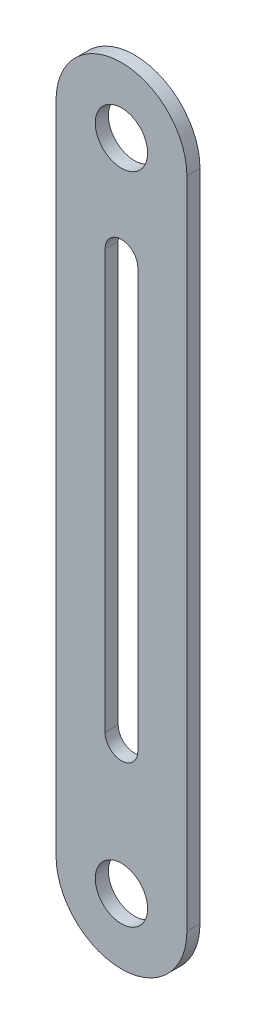
ISO-10303-21;
HEADER;
FILE_DESCRIPTION(('STEP AP214'),'2;1');
FILE_NAME('part.step','',(''),(''),'','','');
FILE_SCHEMA(('AUTOMOTIVE_DESIGN { 1 0 10303 214 1 1 1 1 }'));
ENDSEC;
DATA;
#1=APPLICATION_CONTEXT('core data for automotive mechanical design processes');
#2=APPLICATION_PROTOCOL_DEFINITION('international standard','automotive_design',2000,#1);
#3=PRODUCT_CONTEXT('',#1,'mechanical');
#4=PRODUCT('Part','Part','',(#3));
#5=PRODUCT_RELATED_PRODUCT_CATEGORY('part','',(#4));
#6=PRODUCT_DEFINITION_FORMATION('','',#4);
#7=PRODUCT_DEFINITION_CONTEXT('part definition',#1,'design');
#8=PRODUCT_DEFINITION('design','',#6,#7);
#9=PRODUCT_DEFINITION_SHAPE('','',#8);
#10=(LENGTH_UNIT() NAMED_UNIT(*) SI_UNIT(.MILLI.,.METRE.));
#11=(NAMED_UNIT(*) PLANE_ANGLE_UNIT() SI_UNIT($,.RADIAN.));
#12=(NAMED_UNIT(*) SI_UNIT($,.STERADIAN.) SOLID_ANGLE_UNIT());
#13=UNCERTAINTY_MEASURE_WITH_UNIT(LENGTH_MEASURE(1.E-05),#10,'distance_accuracy_value','');
#14=(GEOMETRIC_REPRESENTATION_CONTEXT(3) GLOBAL_UNCERTAINTY_ASSIGNED_CONTEXT((#13)) GLOBAL_UNIT_ASSIGNED_CONTEXT((#10,
#11,#12)) REPRESENTATION_CONTEXT('',''));
#15=CARTESIAN_POINT('',(0.,0.,0.));
#16=DIRECTION('',(0.,0.,1.));
#17=DIRECTION('',(1.,0.,0.));
#18=AXIS2_PLACEMENT_3D('',#15,#16,#17);
#19=CARTESIAN_POINT('',(0.,-200.,4.));
#20=DIRECTION('',(0.,0.,1.));
#21=DIRECTION('',(1.,0.,0.));
#22=AXIS2_PLACEMENT_3D('',#19,#20,#21);
#23=PLANE('',#22);
#24=CARTESIAN_POINT('',(0.,-31.8450046889655,4.));
#25=DIRECTION('',(0.,0.,1.));
#26=DIRECTION('',(-1.,0.,0.));
#27=AXIS2_PLACEMENT_3D('',#24,#25,#26);
#28=CIRCLE('',#27,5.00000000000001);
#29=CARTESIAN_POINT('',(5.00000000000002,-31.8450046889655,4.));
#30=VERTEX_POINT('',#29);
#31=CARTESIAN_POINT('',(-5.,-31.8450046889655,4.));
#32=VERTEX_POINT('',#31);
#33=EDGE_CURVE('E49',#30,#32,#28,.T.);
#34=ORIENTED_EDGE('',*,*,#33,.F.);
#35=DIRECTION('',(0.,1.,0.));
#36=VECTOR('',#35,1.);
#37=CARTESIAN_POINT('',(5.00000000000002,-159.845004688965,4.));
#38=LINE('',#37,#36);
#39=CARTESIAN_POINT('',(5.00000000000002,-159.845004688965,4.));
#40=VERTEX_POINT('',#39);
#41=EDGE_CURVE('E117',#40,#30,#38,.T.);
#42=ORIENTED_EDGE('',*,*,#41,.F.);
#43=CARTESIAN_POINT('',(0.,-159.845004688965,4.));
#44=DIRECTION('',(0.,0.,1.));
#45=DIRECTION('',(1.,0.,0.));
#46=AXIS2_PLACEMENT_3D('',#43,#44,#45);
#47=CIRCLE('',#46,5.);
#48=CARTESIAN_POINT('',(-4.99999999999998,-159.845004688965,4.));
#49=VERTEX_POINT('',#48);
#50=EDGE_CURVE('E120',#49,#40,#47,.T.);
#51=ORIENTED_EDGE('',*,*,#50,.F.);
#52=DIRECTION('',(0.,-1.,0.));
#53=VECTOR('',#52,1.);
#54=CARTESIAN_POINT('',(-5.,-31.8450046889655,4.));
#55=LINE('',#54,#53);
#56=EDGE_CURVE('E126',#32,#49,#55,.T.);
#57=ORIENTED_EDGE('',*,*,#56,.F.);
#58=EDGE_LOOP('',(#34,#42,#51,#57));
#59=FACE_BOUND('',#58,.T.);
#60=CARTESIAN_POINT('',(0.,0.,4.));
#61=DIRECTION('',(0.,0.,1.));
#62=DIRECTION('',(1.,0.,0.));
#63=AXIS2_PLACEMENT_3D('',#60,#61,#62);
#64=CIRCLE('',#63,8.);
#65=CARTESIAN_POINT('',(8.,0.,4.));
#66=VERTEX_POINT('',#65);
#67=EDGE_CURVE('E142',#66,#66,#64,.T.);
#68=ORIENTED_EDGE('',*,*,#67,.F.);
#69=EDGE_LOOP('',(#68));
#70=FACE_BOUND('',#69,.T.);
#71=CARTESIAN_POINT('',(0.,-200.,4.));
#72=DIRECTION('',(0.,0.,1.));
#73=DIRECTION('',(1.,0.,0.));
#74=AXIS2_PLACEMENT_3D('',#71,#72,#73);
#75=CIRCLE('',#74,20.);
#76=CARTESIAN_POINT('',(-20.,-200.,4.));
#77=VERTEX_POINT('',#76);
#78=CARTESIAN_POINT('',(20.,-200.,4.));
#79=VERTEX_POINT('',#78);
#80=EDGE_CURVE('E148',#77,#79,#75,.T.);
#81=ORIENTED_EDGE('',*,*,#80,.T.);
#82=DIRECTION('',(0.,1.,0.));
#83=VECTOR('',#82,1.);
#84=CARTESIAN_POINT('',(20.,-200.,4.));
#85=LINE('',#84,#83);
#86=CARTESIAN_POINT('',(20.,0.,4.));
#87=VERTEX_POINT('',#86);
#88=EDGE_CURVE('E151',#79,#87,#85,.T.);
#89=ORIENTED_EDGE('',*,*,#88,.T.);
#90=CARTESIAN_POINT('',(0.,0.,4.));
#91=DIRECTION('',(0.,0.,1.));
#92=DIRECTION('',(1.,0.,0.));
#93=AXIS2_PLACEMENT_3D('',#90,#91,#92);
#94=CIRCLE('',#93,20.);
#95=CARTESIAN_POINT('',(-20.,0.,4.));
#96=VERTEX_POINT('',#95);
#97=EDGE_CURVE('E154',#87,#96,#94,.T.);
#98=ORIENTED_EDGE('',*,*,#97,.T.);
#99=DIRECTION('',(0.,-1.,0.));
#100=VECTOR('',#99,1.);
#101=CARTESIAN_POINT('',(-20.,0.,4.));
#102=LINE('',#101,#100);
#103=EDGE_CURVE('E156',#96,#77,#102,.T.);
#104=ORIENTED_EDGE('',*,*,#103,.T.);
#105=EDGE_LOOP('',(#81,#89,#98,#104));
#106=FACE_BOUND('',#105,.T.);
#107=CARTESIAN_POINT('',(0.,-200.,4.));
#108=DIRECTION('',(0.,0.,1.));
#109=DIRECTION('',(1.,0.,0.));
#110=AXIS2_PLACEMENT_3D('',#107,#108,#109);
#111=CIRCLE('',#110,8.);
#112=CARTESIAN_POINT('',(8.00000000000003,-200.,4.));
#113=VERTEX_POINT('',#112);
#114=EDGE_CURVE('E136',#113,#113,#111,.T.);
#115=ORIENTED_EDGE('',*,*,#114,.F.);
#116=EDGE_LOOP('',(#115));
#117=FACE_BOUND('',#116,.T.);
#118=ADVANCED_FACE('F34',(#59,#70,#106,#117),#23,.T.);
#119=CARTESIAN_POINT('',(0.,-200.,0.));
#120=DIRECTION('',(0.,0.,1.));
#121=DIRECTION('',(1.,0.,0.));
#122=AXIS2_PLACEMENT_3D('',#119,#120,#121);
#123=PLANE('',#122);
#124=DIRECTION('',(0.,1.,0.));
#125=VECTOR('',#124,1.);
#126=CARTESIAN_POINT('',(5.00000000000002,-159.845004688965,0.));
#127=LINE('',#126,#125);
#128=CARTESIAN_POINT('',(5.00000000000002,-159.845004688965,0.));
#129=VERTEX_POINT('',#128);
#130=CARTESIAN_POINT('',(5.00000000000002,-31.8450046889655,0.));
#131=VERTEX_POINT('',#130);
#132=EDGE_CURVE('E107',#129,#131,#127,.T.);
#133=ORIENTED_EDGE('',*,*,#132,.T.);
#134=CARTESIAN_POINT('',(0.,-31.8450046889655,0.));
#135=DIRECTION('',(0.,0.,1.));
#136=DIRECTION('',(-1.,0.,0.));
#137=AXIS2_PLACEMENT_3D('',#134,#135,#136);
#138=CIRCLE('',#137,5.00000000000001);
#139=CARTESIAN_POINT('',(-5.,-31.8450046889655,0.));
#140=VERTEX_POINT('',#139);
#141=EDGE_CURVE('E101',#131,#140,#138,.T.);
#142=ORIENTED_EDGE('',*,*,#141,.T.);
#143=DIRECTION('',(0.,-1.,0.));
#144=VECTOR('',#143,1.);
#145=CARTESIAN_POINT('',(-5.,-31.8450046889655,0.));
#146=LINE('',#145,#144);
#147=CARTESIAN_POINT('',(-4.99999999999998,-159.845004688965,0.));
#148=VERTEX_POINT('',#147);
#149=EDGE_CURVE('E110',#140,#148,#146,.T.);
#150=ORIENTED_EDGE('',*,*,#149,.T.);
#151=CARTESIAN_POINT('',(0.,-159.845004688965,0.));
#152=DIRECTION('',(0.,0.,1.));
#153=DIRECTION('',(1.,0.,0.));
#154=AXIS2_PLACEMENT_3D('',#151,#152,#153);
#155=CIRCLE('',#154,5.);
#156=EDGE_CURVE('E57',#148,#129,#155,.T.);
#157=ORIENTED_EDGE('',*,*,#156,.T.);
#158=EDGE_LOOP('',(#133,#142,#150,#157));
#159=FACE_BOUND('',#158,.T.);
#160=CARTESIAN_POINT('',(0.,-200.,0.));
#161=DIRECTION('',(0.,0.,1.));
#162=DIRECTION('',(1.,0.,0.));
#163=AXIS2_PLACEMENT_3D('',#160,#161,#162);
#164=CIRCLE('',#163,20.);
#165=CARTESIAN_POINT('',(-20.,-200.,0.));
#166=VERTEX_POINT('',#165);
#167=CARTESIAN_POINT('',(20.,-200.,0.));
#168=VERTEX_POINT('',#167);
#169=EDGE_CURVE('E145',#166,#168,#164,.T.);
#170=ORIENTED_EDGE('',*,*,#169,.F.);
#171=DIRECTION('',(0.,-1.,0.));
#172=VECTOR('',#171,1.);
#173=CARTESIAN_POINT('',(-20.,0.,0.));
#174=LINE('',#173,#172);
#175=CARTESIAN_POINT('',(-20.,0.,0.));
#176=VERTEX_POINT('',#175);
#177=EDGE_CURVE('E152',#176,#166,#174,.T.);
#178=ORIENTED_EDGE('',*,*,#177,.F.);
#179=CARTESIAN_POINT('',(0.,0.,0.));
#180=DIRECTION('',(0.,0.,1.));
#181=DIRECTION('',(1.,0.,0.));
#182=AXIS2_PLACEMENT_3D('',#179,#180,#181);
#183=CIRCLE('',#182,20.);
#184=CARTESIAN_POINT('',(20.,0.,0.));
#185=VERTEX_POINT('',#184);
#186=EDGE_CURVE('E163',#185,#176,#183,.T.);
#187=ORIENTED_EDGE('',*,*,#186,.F.);
#188=DIRECTION('',(0.,1.,0.));
#189=VECTOR('',#188,1.);
#190=CARTESIAN_POINT('',(20.,-200.,0.));
#191=LINE('',#190,#189);
#192=EDGE_CURVE('E161',#168,#185,#191,.T.);
#193=ORIENTED_EDGE('',*,*,#192,.F.);
#194=EDGE_LOOP('',(#170,#178,#187,#193));
#195=FACE_BOUND('',#194,.T.);
#196=CARTESIAN_POINT('',(0.,0.,0.));
#197=DIRECTION('',(0.,0.,1.));
#198=DIRECTION('',(1.,0.,0.));
#199=AXIS2_PLACEMENT_3D('',#196,#197,#198);
#200=CIRCLE('',#199,8.);
#201=CARTESIAN_POINT('',(8.,0.,0.));
#202=VERTEX_POINT('',#201);
#203=EDGE_CURVE('E139',#202,#202,#200,.T.);
#204=ORIENTED_EDGE('',*,*,#203,.T.);
#205=EDGE_LOOP('',(#204));
#206=FACE_BOUND('',#205,.T.);
#207=CARTESIAN_POINT('',(0.,-200.,0.));
#208=DIRECTION('',(0.,0.,1.));
#209=DIRECTION('',(1.,0.,0.));
#210=AXIS2_PLACEMENT_3D('',#207,#208,#209);
#211=CIRCLE('',#210,8.);
#212=CARTESIAN_POINT('',(8.00000000000003,-200.,0.));
#213=VERTEX_POINT('',#212);
#214=EDGE_CURVE('E132',#213,#213,#211,.T.);
#215=ORIENTED_EDGE('',*,*,#214,.T.);
#216=EDGE_LOOP('',(#215));
#217=FACE_BOUND('',#216,.T.);
#218=ADVANCED_FACE('F114',(#159,#195,#206,#217),#123,.F.);
#219=CARTESIAN_POINT('',(0.,-200.,4.));
#220=DIRECTION('',(0.,0.,-1.));
#221=DIRECTION('',(-1.,0.,0.));
#222=AXIS2_PLACEMENT_3D('',#219,#220,#221);
#223=CYLINDRICAL_SURFACE('',#222,20.);
#224=ORIENTED_EDGE('',*,*,#169,.T.);
#225=DIRECTION('',(0.,0.,-1.));
#226=VECTOR('',#225,1.);
#227=CARTESIAN_POINT('',(20.,-200.,4.));
#228=LINE('',#227,#226);
#229=EDGE_CURVE('E11',#79,#168,#228,.T.);
#230=ORIENTED_EDGE('',*,*,#229,.F.);
#231=ORIENTED_EDGE('',*,*,#80,.F.);
#232=DIRECTION('',(0.,0.,-1.));
#233=VECTOR('',#232,1.);
#234=CARTESIAN_POINT('',(-20.,-200.,4.));
#235=LINE('',#234,#233);
#236=EDGE_CURVE('E158',#77,#166,#235,.T.);
#237=ORIENTED_EDGE('',*,*,#236,.T.);
#238=EDGE_LOOP('',(#224,#230,#231,#237));
#239=FACE_BOUND('',#238,.T.);
#240=ADVANCED_FACE('F36',(#239),#223,.T.);
#241=CARTESIAN_POINT('',(20.,-200.,4.));
#242=DIRECTION('',(-1.,0.,0.));
#243=DIRECTION('',(0.,-1.,0.));
#244=AXIS2_PLACEMENT_3D('',#241,#242,#243);
#245=PLANE('',#244);
#246=ORIENTED_EDGE('',*,*,#192,.T.);
#247=DIRECTION('',(0.,0.,-1.));
#248=VECTOR('',#247,1.);
#249=CARTESIAN_POINT('',(20.,0.,4.));
#250=LINE('',#249,#248);
#251=EDGE_CURVE('E42',#87,#185,#250,.T.);
#252=ORIENTED_EDGE('',*,*,#251,.F.);
#253=ORIENTED_EDGE('',*,*,#88,.F.);
#254=ORIENTED_EDGE('',*,*,#229,.T.);
#255=EDGE_LOOP('',(#246,#252,#253,#254));
#256=FACE_BOUND('',#255,.T.);
#257=ADVANCED_FACE('F190',(#256),#245,.F.);
#258=CARTESIAN_POINT('',(0.,0.,4.));
#259=DIRECTION('',(0.,0.,-1.));
#260=DIRECTION('',(-1.,0.,0.));
#261=AXIS2_PLACEMENT_3D('',#258,#259,#260);
#262=CYLINDRICAL_SURFACE('',#261,20.);
#263=ORIENTED_EDGE('',*,*,#186,.T.);
#264=DIRECTION('',(0.,0.,-1.));
#265=VECTOR('',#264,1.);
#266=CARTESIAN_POINT('',(-20.,0.,4.));
#267=LINE('',#266,#265);
#268=EDGE_CURVE('E168',#96,#176,#267,.T.);
#269=ORIENTED_EDGE('',*,*,#268,.F.);
#270=ORIENTED_EDGE('',*,*,#97,.F.);
#271=ORIENTED_EDGE('',*,*,#251,.T.);
#272=EDGE_LOOP('',(#263,#269,#270,#271));
#273=FACE_BOUND('',#272,.T.);
#274=ADVANCED_FACE('F175',(#273),#262,.T.);
#275=CARTESIAN_POINT('',(-20.,0.,4.));
#276=DIRECTION('',(1.,0.,0.));
#277=DIRECTION('',(0.,1.,0.));
#278=AXIS2_PLACEMENT_3D('',#275,#276,#277);
#279=PLANE('',#278);
#280=ORIENTED_EDGE('',*,*,#177,.T.);
#281=ORIENTED_EDGE('',*,*,#236,.F.);
#282=ORIENTED_EDGE('',*,*,#103,.F.);
#283=ORIENTED_EDGE('',*,*,#268,.T.);
#284=EDGE_LOOP('',(#280,#281,#282,#283));
#285=FACE_BOUND('',#284,.T.);
#286=ADVANCED_FACE('F183',(#285),#279,.F.);
#287=CARTESIAN_POINT('',(0.,0.,4.));
#288=DIRECTION('',(0.,0.,-1.));
#289=DIRECTION('',(-1.,0.,0.));
#290=AXIS2_PLACEMENT_3D('',#287,#288,#289);
#291=CYLINDRICAL_SURFACE('',#290,8.);
#292=ORIENTED_EDGE('',*,*,#67,.T.);
#293=EDGE_LOOP('',(#292));
#294=FACE_BOUND('',#293,.T.);
#295=ORIENTED_EDGE('',*,*,#203,.F.);
#296=EDGE_LOOP('',(#295));
#297=FACE_BOUND('',#296,.T.);
#298=ADVANCED_FACE('F206',(#294,#297),#291,.F.);
#299=CARTESIAN_POINT('',(0.,-200.,4.));
#300=DIRECTION('',(0.,0.,-1.));
#301=DIRECTION('',(-1.,0.,0.));
#302=AXIS2_PLACEMENT_3D('',#299,#300,#301);
#303=CYLINDRICAL_SURFACE('',#302,8.);
#304=ORIENTED_EDGE('',*,*,#114,.T.);
#305=EDGE_LOOP('',(#304));
#306=FACE_BOUND('',#305,.T.);
#307=ORIENTED_EDGE('',*,*,#214,.F.);
#308=EDGE_LOOP('',(#307));
#309=FACE_BOUND('',#308,.T.);
#310=ADVANCED_FACE('F213',(#306,#309),#303,.F.);
#311=CARTESIAN_POINT('',(0.,-31.8450046889655,0.));
#312=DIRECTION('',(0.,0.,1.));
#313=DIRECTION('',(1.,0.,0.));
#314=AXIS2_PLACEMENT_3D('',#311,#312,#313);
#315=CYLINDRICAL_SURFACE('',#314,5.00000000000001);
#316=ORIENTED_EDGE('',*,*,#33,.T.);
#317=DIRECTION('',(0.,0.,1.));
#318=VECTOR('',#317,1.);
#319=CARTESIAN_POINT('',(-5.,-31.8450046889655,0.));
#320=LINE('',#319,#318);
#321=EDGE_CURVE('E97',#140,#32,#320,.T.);
#322=ORIENTED_EDGE('',*,*,#321,.F.);
#323=ORIENTED_EDGE('',*,*,#141,.F.);
#324=DIRECTION('',(0.,0.,1.));
#325=VECTOR('',#324,1.);
#326=CARTESIAN_POINT('',(5.00000000000002,-31.8450046889655,0.));
#327=LINE('',#326,#325);
#328=EDGE_CURVE('E130',#131,#30,#327,.T.);
#329=ORIENTED_EDGE('',*,*,#328,.T.);
#330=EDGE_LOOP('',(#316,#322,#323,#329));
#331=FACE_BOUND('',#330,.T.);
#332=ADVANCED_FACE('F99',(#331),#315,.F.);
#333=CARTESIAN_POINT('',(5.00000000000002,-159.845004688965,0.));
#334=DIRECTION('',(1.,0.,0.));
#335=DIRECTION('',(0.,1.,0.));
#336=AXIS2_PLACEMENT_3D('',#333,#334,#335);
#337=PLANE('',#336);
#338=ORIENTED_EDGE('',*,*,#41,.T.);
#339=ORIENTED_EDGE('',*,*,#328,.F.);
#340=ORIENTED_EDGE('',*,*,#132,.F.);
#341=DIRECTION('',(0.,0.,1.));
#342=VECTOR('',#341,1.);
#343=CARTESIAN_POINT('',(5.00000000000002,-159.845004688965,0.));
#344=LINE('',#343,#342);
#345=EDGE_CURVE('E133',#129,#40,#344,.T.);
#346=ORIENTED_EDGE('',*,*,#345,.T.);
#347=EDGE_LOOP('',(#338,#339,#340,#346));
#348=FACE_BOUND('',#347,.T.);
#349=ADVANCED_FACE('F228',(#348),#337,.F.);
#350=CARTESIAN_POINT('',(0.,-159.845004688965,0.));
#351=DIRECTION('',(0.,0.,1.));
#352=DIRECTION('',(1.,0.,0.));
#353=AXIS2_PLACEMENT_3D('',#350,#351,#352);
#354=CYLINDRICAL_SURFACE('',#353,5.);
#355=ORIENTED_EDGE('',*,*,#50,.T.);
#356=ORIENTED_EDGE('',*,*,#345,.F.);
#357=ORIENTED_EDGE('',*,*,#156,.F.);
#358=DIRECTION('',(0.,0.,1.));
#359=VECTOR('',#358,1.);
#360=CARTESIAN_POINT('',(-4.99999999999998,-159.845004688965,0.));
#361=LINE('',#360,#359);
#362=EDGE_CURVE('E106',#148,#49,#361,.T.);
#363=ORIENTED_EDGE('',*,*,#362,.T.);
#364=EDGE_LOOP('',(#355,#356,#357,#363));
#365=FACE_BOUND('',#364,.T.);
#366=ADVANCED_FACE('F233',(#365),#354,.F.);
#367=CARTESIAN_POINT('',(-5.,-31.8450046889655,0.));
#368=DIRECTION('',(-1.,0.,0.));
#369=DIRECTION('',(0.,-1.,0.));
#370=AXIS2_PLACEMENT_3D('',#367,#368,#369);
#371=PLANE('',#370);
#372=ORIENTED_EDGE('',*,*,#56,.T.);
#373=ORIENTED_EDGE('',*,*,#362,.F.);
#374=ORIENTED_EDGE('',*,*,#149,.F.);
#375=ORIENTED_EDGE('',*,*,#321,.T.);
#376=EDGE_LOOP('',(#372,#373,#374,#375));
#377=FACE_BOUND('',#376,.T.);
#378=ADVANCED_FACE('F111',(#377),#371,.F.);
#379=CLOSED_SHELL('',(#118,#218,#240,#257,#274,#286,#298,#310,#332,#349,#366,#378));
#380=MANIFOLD_SOLID_BREP('B2',#379);
#381=ADVANCED_BREP_SHAPE_REPRESENTATION('',(#18,#380),#14);
#382=SHAPE_DEFINITION_REPRESENTATION(#9,#381);
ENDSEC;
END-ISO-10303-21;
